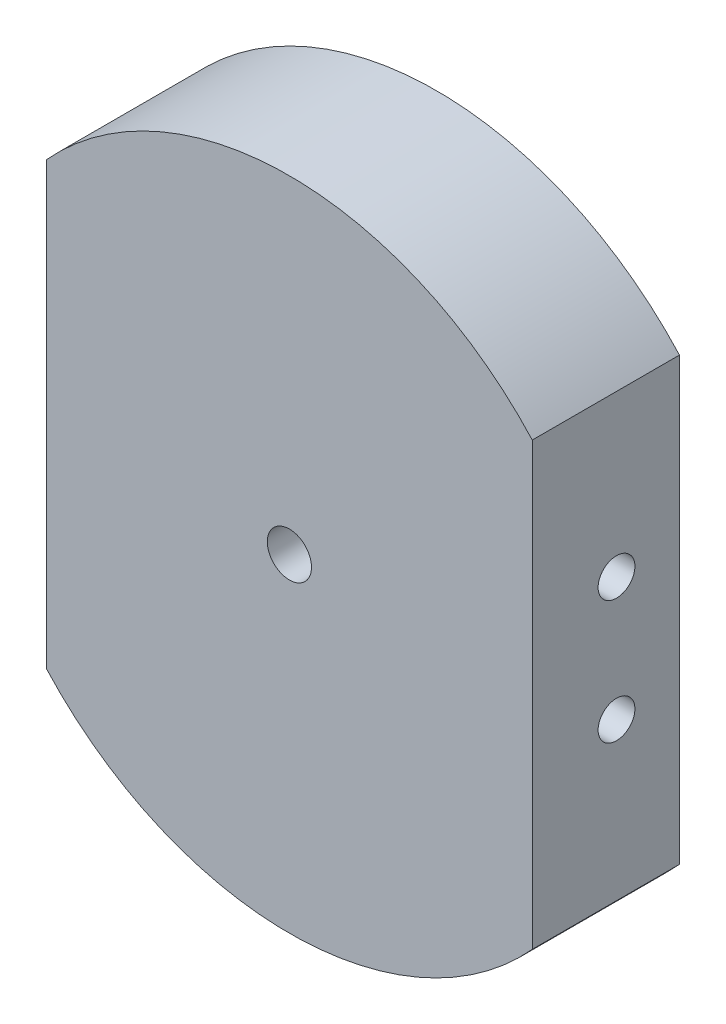
ISO-10303-21;
HEADER;
FILE_DESCRIPTION(('STEP AP214'),'2;1');
FILE_NAME('part.step','',(''),(''),'','','');
FILE_SCHEMA(('AUTOMOTIVE_DESIGN { 1 0 10303 214 1 1 1 1 }'));
ENDSEC;
DATA;
#1=APPLICATION_CONTEXT('core data for automotive mechanical design processes');
#2=APPLICATION_PROTOCOL_DEFINITION('international standard','automotive_design',2000,#1);
#3=PRODUCT_CONTEXT('',#1,'mechanical');
#4=PRODUCT('Part','Part','',(#3));
#5=PRODUCT_RELATED_PRODUCT_CATEGORY('part','',(#4));
#6=PRODUCT_DEFINITION_FORMATION('','',#4);
#7=PRODUCT_DEFINITION_CONTEXT('part definition',#1,'design');
#8=PRODUCT_DEFINITION('design','',#6,#7);
#9=PRODUCT_DEFINITION_SHAPE('','',#8);
#10=(LENGTH_UNIT() NAMED_UNIT(*) SI_UNIT(.MILLI.,.METRE.));
#11=(NAMED_UNIT(*) PLANE_ANGLE_UNIT() SI_UNIT($,.RADIAN.));
#12=(NAMED_UNIT(*) SI_UNIT($,.STERADIAN.) SOLID_ANGLE_UNIT());
#13=UNCERTAINTY_MEASURE_WITH_UNIT(LENGTH_MEASURE(1.E-05),#10,'distance_accuracy_value','');
#14=(GEOMETRIC_REPRESENTATION_CONTEXT(3) GLOBAL_UNCERTAINTY_ASSIGNED_CONTEXT((#13)) GLOBAL_UNIT_ASSIGNED_CONTEXT((#10,
#11,#12)) REPRESENTATION_CONTEXT('',''));
#15=CARTESIAN_POINT('',(0.,0.,0.));
#16=DIRECTION('',(0.,0.,1.));
#17=DIRECTION('',(1.,0.,0.));
#18=AXIS2_PLACEMENT_3D('',#15,#16,#17);
#19=CARTESIAN_POINT('',(0.,0.,0.));
#20=DIRECTION('',(0.,0.,1.));
#21=DIRECTION('',(1.,0.,0.));
#22=AXIS2_PLACEMENT_3D('',#19,#20,#21);
#23=PLANE('',#22);
#24=CARTESIAN_POINT('',(0.,0.,0.));
#25=DIRECTION('',(0.,0.,1.));
#26=DIRECTION('',(1.,0.,0.));
#27=AXIS2_PLACEMENT_3D('',#24,#25,#26);
#28=CIRCLE('',#27,3.);
#29=CARTESIAN_POINT('',(3.,0.,0.));
#30=VERTEX_POINT('',#29);
#31=EDGE_CURVE('E98',#30,#30,#28,.T.);
#32=ORIENTED_EDGE('',*,*,#31,.T.);
#33=EDGE_LOOP('',(#32));
#34=FACE_BOUND('',#33,.T.);
#35=CARTESIAN_POINT('',(0.,0.,0.));
#36=DIRECTION('',(0.,0.,1.));
#37=DIRECTION('',(1.,0.,0.));
#38=AXIS2_PLACEMENT_3D('',#35,#36,#37);
#39=CIRCLE('',#38,44.5764398015129);
#40=CARTESIAN_POINT('',(-33.,-29.9676322951597,0.));
#41=VERTEX_POINT('',#40);
#42=CARTESIAN_POINT('',(33.,-29.9676322951597,0.));
#43=VERTEX_POINT('',#42);
#44=EDGE_CURVE('E84',#41,#43,#39,.T.);
#45=ORIENTED_EDGE('',*,*,#44,.F.);
#46=DIRECTION('',(0.,-1.,0.));
#47=VECTOR('',#46,1.);
#48=CARTESIAN_POINT('',(-33.,0.,0.));
#49=LINE('',#48,#47);
#50=CARTESIAN_POINT('',(-33.,29.9676322951597,0.));
#51=VERTEX_POINT('',#50);
#52=EDGE_CURVE('E75',#51,#41,#49,.T.);
#53=ORIENTED_EDGE('',*,*,#52,.F.);
#54=CARTESIAN_POINT('',(0.,0.,0.));
#55=DIRECTION('',(0.,0.,1.));
#56=DIRECTION('',(1.,0.,0.));
#57=AXIS2_PLACEMENT_3D('',#54,#55,#56);
#58=CIRCLE('',#57,44.5764398015129);
#59=CARTESIAN_POINT('',(33.,29.9676322951597,0.));
#60=VERTEX_POINT('',#59);
#61=EDGE_CURVE('E83',#60,#51,#58,.T.);
#62=ORIENTED_EDGE('',*,*,#61,.F.);
#63=DIRECTION('',(0.,-1.,0.));
#64=VECTOR('',#63,1.);
#65=CARTESIAN_POINT('',(33.,0.,0.));
#66=LINE('',#65,#64);
#67=EDGE_CURVE('E56',#60,#43,#66,.T.);
#68=ORIENTED_EDGE('',*,*,#67,.T.);
#69=EDGE_LOOP('',(#45,#53,#62,#68));
#70=FACE_BOUND('',#69,.T.);
#71=ADVANCED_FACE('F33',(#34,#70),#23,.F.);
#72=CARTESIAN_POINT('',(0.,0.,20.));
#73=DIRECTION('',(0.,0.,1.));
#74=DIRECTION('',(1.,0.,0.));
#75=AXIS2_PLACEMENT_3D('',#72,#73,#74);
#76=PLANE('',#75);
#77=DIRECTION('',(0.,1.,0.));
#78=VECTOR('',#77,1.);
#79=CARTESIAN_POINT('',(-33.,0.,20.));
#80=LINE('',#79,#78);
#81=CARTESIAN_POINT('',(-33.,-29.9676322951597,20.));
#82=VERTEX_POINT('',#81);
#83=CARTESIAN_POINT('',(-33.,29.9676322951598,20.));
#84=VERTEX_POINT('',#83);
#85=EDGE_CURVE('E49',#82,#84,#80,.T.);
#86=ORIENTED_EDGE('',*,*,#85,.F.);
#87=CARTESIAN_POINT('',(0.,0.,20.));
#88=DIRECTION('',(0.,0.,1.));
#89=DIRECTION('',(1.,0.,0.));
#90=AXIS2_PLACEMENT_3D('',#87,#88,#89);
#91=CIRCLE('',#90,44.5764398015129);
#92=CARTESIAN_POINT('',(33.,-29.9676322951597,20.));
#93=VERTEX_POINT('',#92);
#94=EDGE_CURVE('E91',#82,#93,#91,.T.);
#95=ORIENTED_EDGE('',*,*,#94,.T.);
#96=DIRECTION('',(0.,1.,0.));
#97=VECTOR('',#96,1.);
#98=CARTESIAN_POINT('',(33.,0.,20.));
#99=LINE('',#98,#97);
#100=CARTESIAN_POINT('',(33.,29.9676322951597,20.));
#101=VERTEX_POINT('',#100);
#102=EDGE_CURVE('E93',#93,#101,#99,.T.);
#103=ORIENTED_EDGE('',*,*,#102,.T.);
#104=CARTESIAN_POINT('',(0.,0.,20.));
#105=DIRECTION('',(0.,0.,1.));
#106=DIRECTION('',(1.,0.,0.));
#107=AXIS2_PLACEMENT_3D('',#104,#105,#106);
#108=CIRCLE('',#107,44.5764398015129);
#109=EDGE_CURVE('E89',#84,#101,#108,.F.);
#110=ORIENTED_EDGE('',*,*,#109,.F.);
#111=EDGE_LOOP('',(#86,#95,#103,#110));
#112=FACE_BOUND('',#111,.T.);
#113=CARTESIAN_POINT('',(0.,0.,20.));
#114=DIRECTION('',(0.,0.,1.));
#115=DIRECTION('',(1.,0.,0.));
#116=AXIS2_PLACEMENT_3D('',#113,#114,#115);
#117=CIRCLE('',#116,3.);
#118=CARTESIAN_POINT('',(3.,0.,20.));
#119=VERTEX_POINT('',#118);
#120=EDGE_CURVE('E99',#119,#119,#117,.T.);
#121=ORIENTED_EDGE('',*,*,#120,.F.);
#122=EDGE_LOOP('',(#121));
#123=FACE_BOUND('',#122,.T.);
#124=ADVANCED_FACE('F123',(#112,#123),#76,.T.);
#125=CARTESIAN_POINT('',(0.,0.,10.));
#126=DIRECTION('',(0.,0.,1.));
#127=DIRECTION('',(1.,0.,0.));
#128=AXIS2_PLACEMENT_3D('',#125,#126,#127);
#129=CYLINDRICAL_SURFACE('',#128,44.5764398015129);
#130=DIRECTION('',(0.,0.,-1.));
#131=VECTOR('',#130,1.);
#132=CARTESIAN_POINT('',(-33.,-29.9676322951597,58.));
#133=LINE('',#132,#131);
#134=EDGE_CURVE('E85',#82,#41,#133,.T.);
#135=ORIENTED_EDGE('',*,*,#134,.T.);
#136=ORIENTED_EDGE('',*,*,#44,.T.);
#137=DIRECTION('',(0.,0.,-1.));
#138=VECTOR('',#137,1.);
#139=CARTESIAN_POINT('',(33.,-29.9676322951597,58.));
#140=LINE('',#139,#138);
#141=EDGE_CURVE('E119',#93,#43,#140,.T.);
#142=ORIENTED_EDGE('',*,*,#141,.F.);
#143=ORIENTED_EDGE('',*,*,#94,.F.);
#144=EDGE_LOOP('',(#135,#136,#142,#143));
#145=FACE_BOUND('',#144,.T.);
#146=ADVANCED_FACE('F129',(#145),#129,.T.);
#147=CARTESIAN_POINT('',(0.,0.,10.));
#148=DIRECTION('',(0.,0.,1.));
#149=DIRECTION('',(1.,0.,0.));
#150=AXIS2_PLACEMENT_3D('',#147,#148,#149);
#151=CYLINDRICAL_SURFACE('',#150,44.5764398015129);
#152=ORIENTED_EDGE('',*,*,#61,.T.);
#153=DIRECTION('',(0.,0.,1.));
#154=VECTOR('',#153,1.);
#155=CARTESIAN_POINT('',(-33.,29.9676322951598,10.));
#156=LINE('',#155,#154);
#157=EDGE_CURVE('E11',#51,#84,#156,.T.);
#158=ORIENTED_EDGE('',*,*,#157,.T.);
#159=ORIENTED_EDGE('',*,*,#109,.T.);
#160=DIRECTION('',(0.,0.,1.));
#161=VECTOR('',#160,1.);
#162=CARTESIAN_POINT('',(33.,29.9676322951598,10.));
#163=LINE('',#162,#161);
#164=EDGE_CURVE('E41',#60,#101,#163,.T.);
#165=ORIENTED_EDGE('',*,*,#164,.F.);
#166=EDGE_LOOP('',(#152,#158,#159,#165));
#167=FACE_BOUND('',#166,.T.);
#168=ADVANCED_FACE('F88',(#167),#151,.T.);
#169=CARTESIAN_POINT('',(0.,0.,20.));
#170=DIRECTION('',(0.,0.,-1.));
#171=DIRECTION('',(-1.,0.,0.));
#172=AXIS2_PLACEMENT_3D('',#169,#170,#171);
#173=CYLINDRICAL_SURFACE('',#172,3.);
#174=ORIENTED_EDGE('',*,*,#120,.T.);
#175=EDGE_LOOP('',(#174));
#176=FACE_BOUND('',#175,.T.);
#177=ORIENTED_EDGE('',*,*,#31,.F.);
#178=EDGE_LOOP('',(#177));
#179=FACE_BOUND('',#178,.T.);
#180=ADVANCED_FACE('F136',(#176,#179),#173,.F.);
#181=CARTESIAN_POINT('',(33.,0.,58.));
#182=DIRECTION('',(1.,0.,0.));
#183=DIRECTION('',(0.,0.,-1.));
#184=AXIS2_PLACEMENT_3D('',#181,#182,#183);
#185=PLANE('',#184);
#186=CARTESIAN_POINT('',(33.,8.13999999999987,8.55326289640541));
#187=DIRECTION('',(1.,0.,0.));
#188=DIRECTION('',(0.,0.,-1.));
#189=AXIS2_PLACEMENT_3D('',#186,#187,#188);
#190=CIRCLE('',#189,2.5);
#191=CARTESIAN_POINT('',(33.,8.13999999999987,6.05326289640541));
#192=VERTEX_POINT('',#191);
#193=EDGE_CURVE('E113',#192,#192,#190,.T.);
#194=ORIENTED_EDGE('',*,*,#193,.F.);
#195=EDGE_LOOP('',(#194));
#196=FACE_BOUND('',#195,.T.);
#197=CARTESIAN_POINT('',(33.,-8.63891145506673,8.55326289640541));
#198=DIRECTION('',(1.,0.,0.));
#199=DIRECTION('',(0.,0.,-1.));
#200=AXIS2_PLACEMENT_3D('',#197,#198,#199);
#201=CIRCLE('',#200,2.5);
#202=CARTESIAN_POINT('',(33.,-8.63891145506673,6.05326289640541));
#203=VERTEX_POINT('',#202);
#204=EDGE_CURVE('E105',#203,#203,#201,.T.);
#205=ORIENTED_EDGE('',*,*,#204,.F.);
#206=EDGE_LOOP('',(#205));
#207=FACE_BOUND('',#206,.T.);
#208=ORIENTED_EDGE('',*,*,#141,.T.);
#209=ORIENTED_EDGE('',*,*,#67,.F.);
#210=ORIENTED_EDGE('',*,*,#164,.T.);
#211=ORIENTED_EDGE('',*,*,#102,.F.);
#212=EDGE_LOOP('',(#208,#209,#210,#211));
#213=FACE_BOUND('',#212,.T.);
#214=ADVANCED_FACE('F127',(#196,#207,#213),#185,.T.);
#215=CARTESIAN_POINT('',(-33.,0.,58.));
#216=DIRECTION('',(1.,0.,0.));
#217=DIRECTION('',(0.,0.,-1.));
#218=AXIS2_PLACEMENT_3D('',#215,#216,#217);
#219=PLANE('',#218);
#220=CARTESIAN_POINT('',(-33.,8.13999999999987,8.55326289640541));
#221=DIRECTION('',(1.,0.,0.));
#222=DIRECTION('',(0.,0.,-1.));
#223=AXIS2_PLACEMENT_3D('',#220,#221,#222);
#224=CIRCLE('',#223,2.5);
#225=CARTESIAN_POINT('',(-33.,8.13999999999987,6.05326289640541));
#226=VERTEX_POINT('',#225);
#227=EDGE_CURVE('E36',#226,#226,#224,.T.);
#228=ORIENTED_EDGE('',*,*,#227,.T.);
#229=EDGE_LOOP('',(#228));
#230=FACE_BOUND('',#229,.T.);
#231=CARTESIAN_POINT('',(-33.,-8.63891145506673,8.55326289640541));
#232=DIRECTION('',(1.,0.,0.));
#233=DIRECTION('',(0.,0.,-1.));
#234=AXIS2_PLACEMENT_3D('',#231,#232,#233);
#235=CIRCLE('',#234,2.5);
#236=CARTESIAN_POINT('',(-33.,-8.63891145506673,6.05326289640541));
#237=VERTEX_POINT('',#236);
#238=EDGE_CURVE('E86',#237,#237,#235,.T.);
#239=ORIENTED_EDGE('',*,*,#238,.T.);
#240=EDGE_LOOP('',(#239));
#241=FACE_BOUND('',#240,.T.);
#242=ORIENTED_EDGE('',*,*,#85,.T.);
#243=ORIENTED_EDGE('',*,*,#157,.F.);
#244=ORIENTED_EDGE('',*,*,#52,.T.);
#245=ORIENTED_EDGE('',*,*,#134,.F.);
#246=EDGE_LOOP('',(#242,#243,#244,#245));
#247=FACE_BOUND('',#246,.T.);
#248=ADVANCED_FACE('F74',(#230,#241,#247),#219,.F.);
#249=CARTESIAN_POINT('',(-77.,-8.63891145506673,8.55326289640541));
#250=DIRECTION('',(1.,0.,0.));
#251=DIRECTION('',(0.,0.,-1.));
#252=AXIS2_PLACEMENT_3D('',#249,#250,#251);
#253=CYLINDRICAL_SURFACE('',#252,2.5);
#254=ORIENTED_EDGE('',*,*,#204,.T.);
#255=EDGE_LOOP('',(#254));
#256=FACE_BOUND('',#255,.T.);
#257=ORIENTED_EDGE('',*,*,#238,.F.);
#258=EDGE_LOOP('',(#257));
#259=FACE_BOUND('',#258,.T.);
#260=ADVANCED_FACE('F158',(#256,#259),#253,.F.);
#261=CARTESIAN_POINT('',(-77.,8.13999999999987,8.55326289640541));
#262=DIRECTION('',(1.,0.,0.));
#263=DIRECTION('',(0.,0.,-1.));
#264=AXIS2_PLACEMENT_3D('',#261,#262,#263);
#265=CYLINDRICAL_SURFACE('',#264,2.5);
#266=ORIENTED_EDGE('',*,*,#193,.T.);
#267=EDGE_LOOP('',(#266));
#268=FACE_BOUND('',#267,.T.);
#269=ORIENTED_EDGE('',*,*,#227,.F.);
#270=EDGE_LOOP('',(#269));
#271=FACE_BOUND('',#270,.T.);
#272=ADVANCED_FACE('F166',(#268,#271),#265,.F.);
#273=CLOSED_SHELL('',(#71,#124,#146,#168,#180,#214,#248,#260,#272));
#274=MANIFOLD_SOLID_BREP('B2',#273);
#275=ADVANCED_BREP_SHAPE_REPRESENTATION('',(#18,#274),#14);
#276=SHAPE_DEFINITION_REPRESENTATION(#9,#275);
ENDSEC;
END-ISO-10303-21;
